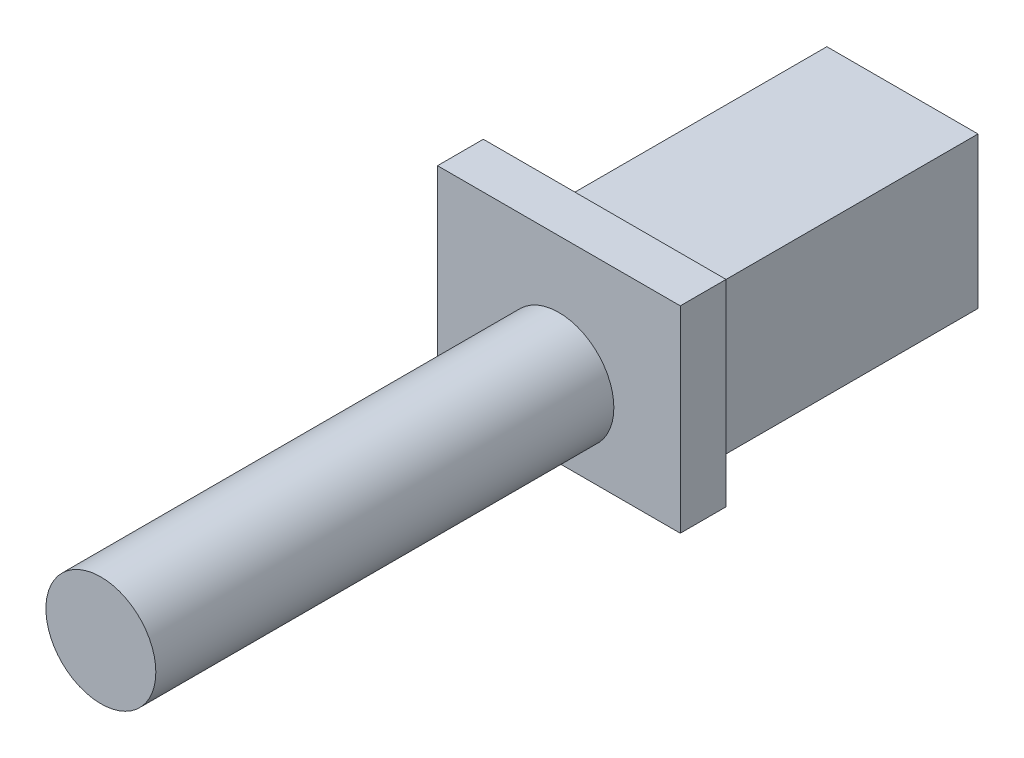
ISO-10303-21;
HEADER;
FILE_DESCRIPTION(('STEP AP214'),'2;1');
FILE_NAME('part.step','',(''),(''),'','','');
FILE_SCHEMA(('AUTOMOTIVE_DESIGN { 1 0 10303 214 1 1 1 1 }'));
ENDSEC;
DATA;
#1=APPLICATION_CONTEXT('core data for automotive mechanical design processes');
#2=APPLICATION_PROTOCOL_DEFINITION('international standard','automotive_design',2000,#1);
#3=PRODUCT_CONTEXT('',#1,'mechanical');
#4=PRODUCT('Part','Part','',(#3));
#5=PRODUCT_RELATED_PRODUCT_CATEGORY('part','',(#4));
#6=PRODUCT_DEFINITION_FORMATION('','',#4);
#7=PRODUCT_DEFINITION_CONTEXT('part definition',#1,'design');
#8=PRODUCT_DEFINITION('design','',#6,#7);
#9=PRODUCT_DEFINITION_SHAPE('','',#8);
#10=(LENGTH_UNIT() NAMED_UNIT(*) SI_UNIT(.MILLI.,.METRE.));
#11=(NAMED_UNIT(*) PLANE_ANGLE_UNIT() SI_UNIT($,.RADIAN.));
#12=(NAMED_UNIT(*) SI_UNIT($,.STERADIAN.) SOLID_ANGLE_UNIT());
#13=UNCERTAINTY_MEASURE_WITH_UNIT(LENGTH_MEASURE(1.E-05),#10,'distance_accuracy_value','');
#14=(GEOMETRIC_REPRESENTATION_CONTEXT(3) GLOBAL_UNCERTAINTY_ASSIGNED_CONTEXT((#13)) GLOBAL_UNIT_ASSIGNED_CONTEXT((#10,
#11,#12)) REPRESENTATION_CONTEXT('',''));
#15=CARTESIAN_POINT('',(0.,0.,0.));
#16=DIRECTION('',(0.,0.,1.));
#17=DIRECTION('',(1.,0.,0.));
#18=AXIS2_PLACEMENT_3D('',#15,#16,#17);
#19=CARTESIAN_POINT('',(3.3,0.,-15.));
#20=DIRECTION('',(-1.,0.,0.));
#21=DIRECTION('',(0.,-1.,0.));
#22=AXIS2_PLACEMENT_3D('',#19,#20,#21);
#23=PLANE('',#22);
#24=DIRECTION('',(0.,-1.,0.));
#25=VECTOR('',#24,1.);
#26=CARTESIAN_POINT('',(3.3,0.,-2.));
#27=LINE('',#26,#25);
#28=CARTESIAN_POINT('',(3.3,3.3,-2.));
#29=VERTEX_POINT('',#28);
#30=CARTESIAN_POINT('',(3.3,-3.3,-2.));
#31=VERTEX_POINT('',#30);
#32=EDGE_CURVE('E104',#29,#31,#27,.T.);
#33=ORIENTED_EDGE('',*,*,#32,.T.);
#34=DIRECTION('',(0.,0.,1.));
#35=VECTOR('',#34,1.);
#36=CARTESIAN_POINT('',(3.3,-3.3,-15.));
#37=LINE('',#36,#35);
#38=CARTESIAN_POINT('',(3.3,-3.3,-15.));
#39=VERTEX_POINT('',#38);
#40=EDGE_CURVE('E114',#39,#31,#37,.T.);
#41=ORIENTED_EDGE('',*,*,#40,.F.);
#42=DIRECTION('',(0.,-1.,0.));
#43=VECTOR('',#42,1.);
#44=CARTESIAN_POINT('',(3.3,0.,-15.));
#45=LINE('',#44,#43);
#46=CARTESIAN_POINT('',(3.3,3.3,-15.));
#47=VERTEX_POINT('',#46);
#48=EDGE_CURVE('E49',#47,#39,#45,.T.);
#49=ORIENTED_EDGE('',*,*,#48,.F.);
#50=DIRECTION('',(0.,0.,1.));
#51=VECTOR('',#50,1.);
#52=CARTESIAN_POINT('',(3.3,3.3,-15.));
#53=LINE('',#52,#51);
#54=EDGE_CURVE('E116',#47,#29,#53,.T.);
#55=ORIENTED_EDGE('',*,*,#54,.T.);
#56=EDGE_LOOP('',(#33,#41,#49,#55));
#57=FACE_BOUND('',#56,.T.);
#58=ADVANCED_FACE('F34',(#57),#23,.F.);
#59=CARTESIAN_POINT('',(-3.3,0.,-15.));
#60=DIRECTION('',(-1.,0.,0.));
#61=DIRECTION('',(0.,-1.,0.));
#62=AXIS2_PLACEMENT_3D('',#59,#60,#61);
#63=PLANE('',#62);
#64=DIRECTION('',(0.,0.,1.));
#65=VECTOR('',#64,1.);
#66=CARTESIAN_POINT('',(-3.3,-3.3,-15.));
#67=LINE('',#66,#65);
#68=CARTESIAN_POINT('',(-3.3,-3.3,-15.));
#69=VERTEX_POINT('',#68);
#70=CARTESIAN_POINT('',(-3.3,-3.3,-2.));
#71=VERTEX_POINT('',#70);
#72=EDGE_CURVE('E57',#69,#71,#67,.T.);
#73=ORIENTED_EDGE('',*,*,#72,.T.);
#74=DIRECTION('',(0.,-1.,0.));
#75=VECTOR('',#74,1.);
#76=CARTESIAN_POINT('',(-3.3,0.,-2.));
#77=LINE('',#76,#75);
#78=CARTESIAN_POINT('',(-3.3,3.3,-2.));
#79=VERTEX_POINT('',#78);
#80=EDGE_CURVE('E156',#79,#71,#77,.T.);
#81=ORIENTED_EDGE('',*,*,#80,.F.);
#82=DIRECTION('',(0.,0.,1.));
#83=VECTOR('',#82,1.);
#84=CARTESIAN_POINT('',(-3.3,3.3,-15.));
#85=LINE('',#84,#83);
#86=CARTESIAN_POINT('',(-3.3,3.3,-15.));
#87=VERTEX_POINT('',#86);
#88=EDGE_CURVE('E123',#87,#79,#85,.T.);
#89=ORIENTED_EDGE('',*,*,#88,.F.);
#90=DIRECTION('',(0.,-1.,0.));
#91=VECTOR('',#90,1.);
#92=CARTESIAN_POINT('',(-3.3,0.,-15.));
#93=LINE('',#92,#91);
#94=EDGE_CURVE('E131',#87,#69,#93,.T.);
#95=ORIENTED_EDGE('',*,*,#94,.T.);
#96=EDGE_LOOP('',(#73,#81,#89,#95));
#97=FACE_BOUND('',#96,.T.);
#98=ADVANCED_FACE('F195',(#97),#63,.T.);
#99=CARTESIAN_POINT('',(0.,3.3,-15.));
#100=DIRECTION('',(0.,-1.,0.));
#101=DIRECTION('',(0.,0.,-1.));
#102=AXIS2_PLACEMENT_3D('',#99,#100,#101);
#103=PLANE('',#102);
#104=DIRECTION('',(1.,0.,0.));
#105=VECTOR('',#104,1.);
#106=CARTESIAN_POINT('',(0.,3.3,-2.));
#107=LINE('',#106,#105);
#108=EDGE_CURVE('E140',#79,#29,#107,.T.);
#109=ORIENTED_EDGE('',*,*,#108,.T.);
#110=ORIENTED_EDGE('',*,*,#54,.F.);
#111=DIRECTION('',(1.,0.,0.));
#112=VECTOR('',#111,1.);
#113=CARTESIAN_POINT('',(0.,3.3,-15.));
#114=LINE('',#113,#112);
#115=EDGE_CURVE('E132',#87,#47,#114,.T.);
#116=ORIENTED_EDGE('',*,*,#115,.F.);
#117=ORIENTED_EDGE('',*,*,#88,.T.);
#118=EDGE_LOOP('',(#109,#110,#116,#117));
#119=FACE_BOUND('',#118,.T.);
#120=ADVANCED_FACE('F188',(#119),#103,.F.);
#121=CARTESIAN_POINT('',(0.,0.,20.));
#122=DIRECTION('',(0.,0.,-1.));
#123=DIRECTION('',(-1.,0.,0.));
#124=AXIS2_PLACEMENT_3D('',#121,#122,#123);
#125=CYLINDRICAL_SURFACE('',#124,2.4);
#126=CARTESIAN_POINT('',(0.,0.,20.));
#127=DIRECTION('',(0.,0.,1.));
#128=DIRECTION('',(1.,0.,0.));
#129=AXIS2_PLACEMENT_3D('',#126,#127,#128);
#130=CIRCLE('',#129,2.4);
#131=CARTESIAN_POINT('',(2.4,0.,20.));
#132=VERTEX_POINT('',#131);
#133=EDGE_CURVE('E11',#132,#132,#130,.T.);
#134=ORIENTED_EDGE('',*,*,#133,.F.);
#135=EDGE_LOOP('',(#134));
#136=FACE_BOUND('',#135,.T.);
#137=CARTESIAN_POINT('',(0.,0.,0.));
#138=DIRECTION('',(0.,0.,1.));
#139=DIRECTION('',(1.,0.,0.));
#140=AXIS2_PLACEMENT_3D('',#137,#138,#139);
#141=CIRCLE('',#140,2.4);
#142=CARTESIAN_POINT('',(2.4,0.,0.));
#143=VERTEX_POINT('',#142);
#144=EDGE_CURVE('E38',#143,#143,#141,.T.);
#145=ORIENTED_EDGE('',*,*,#144,.T.);
#146=EDGE_LOOP('',(#145));
#147=FACE_BOUND('',#146,.T.);
#148=ADVANCED_FACE('F36',(#136,#147),#125,.T.);
#149=CARTESIAN_POINT('',(0.,0.,20.));
#150=DIRECTION('',(0.,0.,1.));
#151=DIRECTION('',(1.,0.,0.));
#152=AXIS2_PLACEMENT_3D('',#149,#150,#151);
#153=PLANE('',#152);
#154=ORIENTED_EDGE('',*,*,#133,.T.);
#155=EDGE_LOOP('',(#154));
#156=FACE_BOUND('',#155,.T.);
#157=ADVANCED_FACE('F187',(#156),#153,.T.);
#158=CARTESIAN_POINT('',(0.,-3.3,-15.));
#159=DIRECTION('',(0.,-1.,0.));
#160=DIRECTION('',(0.,0.,-1.));
#161=AXIS2_PLACEMENT_3D('',#158,#159,#160);
#162=PLANE('',#161);
#163=DIRECTION('',(1.,0.,0.));
#164=VECTOR('',#163,1.);
#165=CARTESIAN_POINT('',(0.,-3.3,0.));
#166=LINE('',#165,#164);
#167=CARTESIAN_POINT('',(-5.3,-3.3,0.));
#168=VERTEX_POINT('',#167);
#169=CARTESIAN_POINT('',(5.3,-3.3,0.));
#170=VERTEX_POINT('',#169);
#171=EDGE_CURVE('E126',#168,#170,#166,.T.);
#172=ORIENTED_EDGE('',*,*,#171,.F.);
#173=DIRECTION('',(0.,0.,1.));
#174=VECTOR('',#173,1.);
#175=CARTESIAN_POINT('',(-5.3,-3.3,-2.));
#176=LINE('',#175,#174);
#177=CARTESIAN_POINT('',(-5.3,-3.3,-2.));
#178=VERTEX_POINT('',#177);
#179=EDGE_CURVE('E146',#178,#168,#176,.T.);
#180=ORIENTED_EDGE('',*,*,#179,.F.);
#181=DIRECTION('',(-1.,0.,0.));
#182=VECTOR('',#181,1.);
#183=CARTESIAN_POINT('',(0.,-3.3,-2.));
#184=LINE('',#183,#182);
#185=EDGE_CURVE('E158',#71,#178,#184,.T.);
#186=ORIENTED_EDGE('',*,*,#185,.F.);
#187=ORIENTED_EDGE('',*,*,#72,.F.);
#188=DIRECTION('',(1.,0.,0.));
#189=VECTOR('',#188,1.);
#190=CARTESIAN_POINT('',(0.,-3.3,-15.));
#191=LINE('',#190,#189);
#192=EDGE_CURVE('E120',#69,#39,#191,.T.);
#193=ORIENTED_EDGE('',*,*,#192,.T.);
#194=ORIENTED_EDGE('',*,*,#40,.T.);
#195=DIRECTION('',(1.,0.,0.));
#196=VECTOR('',#195,1.);
#197=CARTESIAN_POINT('',(0.,-3.3,-2.));
#198=LINE('',#197,#196);
#199=CARTESIAN_POINT('',(5.3,-3.3,-2.));
#200=VERTEX_POINT('',#199);
#201=EDGE_CURVE('E101',#31,#200,#198,.T.);
#202=ORIENTED_EDGE('',*,*,#201,.T.);
#203=DIRECTION('',(0.,0.,1.));
#204=VECTOR('',#203,1.);
#205=CARTESIAN_POINT('',(5.3,-3.3,-2.));
#206=LINE('',#205,#204);
#207=EDGE_CURVE('E137',#200,#170,#206,.T.);
#208=ORIENTED_EDGE('',*,*,#207,.T.);
#209=EDGE_LOOP('',(#172,#180,#186,#187,#193,#194,#202,#208));
#210=FACE_BOUND('',#209,.T.);
#211=ADVANCED_FACE('F119',(#210),#162,.T.);
#212=CARTESIAN_POINT('',(0.,0.,-15.));
#213=DIRECTION('',(0.,0.,1.));
#214=DIRECTION('',(1.,0.,0.));
#215=AXIS2_PLACEMENT_3D('',#212,#213,#214);
#216=PLANE('',#215);
#217=ORIENTED_EDGE('',*,*,#48,.T.);
#218=ORIENTED_EDGE('',*,*,#192,.F.);
#219=ORIENTED_EDGE('',*,*,#94,.F.);
#220=ORIENTED_EDGE('',*,*,#115,.T.);
#221=EDGE_LOOP('',(#217,#218,#219,#220));
#222=FACE_BOUND('',#221,.T.);
#223=ADVANCED_FACE('F182',(#222),#216,.F.);
#224=CARTESIAN_POINT('',(0.,0.,0.));
#225=DIRECTION('',(0.,0.,1.));
#226=DIRECTION('',(1.,0.,0.));
#227=AXIS2_PLACEMENT_3D('',#224,#225,#226);
#228=PLANE('',#227);
#229=ORIENTED_EDGE('',*,*,#171,.T.);
#230=DIRECTION('',(0.,-1.,0.));
#231=VECTOR('',#230,1.);
#232=CARTESIAN_POINT('',(5.3,0.,0.));
#233=LINE('',#232,#231);
#234=CARTESIAN_POINT('',(5.3,5.3,0.));
#235=VERTEX_POINT('',#234);
#236=EDGE_CURVE('E152',#235,#170,#233,.T.);
#237=ORIENTED_EDGE('',*,*,#236,.F.);
#238=DIRECTION('',(1.,0.,0.));
#239=VECTOR('',#238,1.);
#240=CARTESIAN_POINT('',(0.,5.3,0.));
#241=LINE('',#240,#239);
#242=CARTESIAN_POINT('',(-5.3,5.3,0.));
#243=VERTEX_POINT('',#242);
#244=EDGE_CURVE('E150',#243,#235,#241,.T.);
#245=ORIENTED_EDGE('',*,*,#244,.F.);
#246=DIRECTION('',(0.,1.,0.));
#247=VECTOR('',#246,1.);
#248=CARTESIAN_POINT('',(-5.3,0.,0.));
#249=LINE('',#248,#247);
#250=EDGE_CURVE('E117',#168,#243,#249,.T.);
#251=ORIENTED_EDGE('',*,*,#250,.F.);
#252=EDGE_LOOP('',(#229,#237,#245,#251));
#253=FACE_BOUND('',#252,.T.);
#254=ORIENTED_EDGE('',*,*,#144,.F.);
#255=EDGE_LOOP('',(#254));
#256=FACE_BOUND('',#255,.T.);
#257=ADVANCED_FACE('F179',(#253,#256),#228,.T.);
#258=CARTESIAN_POINT('',(-5.3,0.,-2.));
#259=DIRECTION('',(1.,0.,0.));
#260=DIRECTION('',(0.,0.,-1.));
#261=AXIS2_PLACEMENT_3D('',#258,#259,#260);
#262=PLANE('',#261);
#263=ORIENTED_EDGE('',*,*,#250,.T.);
#264=DIRECTION('',(0.,0.,1.));
#265=VECTOR('',#264,1.);
#266=CARTESIAN_POINT('',(-5.3,5.3,-2.));
#267=LINE('',#266,#265);
#268=CARTESIAN_POINT('',(-5.3,5.3,-2.));
#269=VERTEX_POINT('',#268);
#270=EDGE_CURVE('E143',#269,#243,#267,.T.);
#271=ORIENTED_EDGE('',*,*,#270,.F.);
#272=DIRECTION('',(0.,1.,0.));
#273=VECTOR('',#272,1.);
#274=CARTESIAN_POINT('',(-5.3,0.,-2.));
#275=LINE('',#274,#273);
#276=EDGE_CURVE('E160',#178,#269,#275,.T.);
#277=ORIENTED_EDGE('',*,*,#276,.F.);
#278=ORIENTED_EDGE('',*,*,#179,.T.);
#279=EDGE_LOOP('',(#263,#271,#277,#278));
#280=FACE_BOUND('',#279,.T.);
#281=ADVANCED_FACE('F178',(#280),#262,.F.);
#282=CARTESIAN_POINT('',(0.,5.3,-2.));
#283=DIRECTION('',(0.,-1.,0.));
#284=DIRECTION('',(0.,0.,-1.));
#285=AXIS2_PLACEMENT_3D('',#282,#283,#284);
#286=PLANE('',#285);
#287=ORIENTED_EDGE('',*,*,#244,.T.);
#288=DIRECTION('',(0.,0.,1.));
#289=VECTOR('',#288,1.);
#290=CARTESIAN_POINT('',(5.3,5.3,-2.));
#291=LINE('',#290,#289);
#292=CARTESIAN_POINT('',(5.3,5.3,-2.));
#293=VERTEX_POINT('',#292);
#294=EDGE_CURVE('E139',#293,#235,#291,.T.);
#295=ORIENTED_EDGE('',*,*,#294,.F.);
#296=DIRECTION('',(1.,0.,0.));
#297=VECTOR('',#296,1.);
#298=CARTESIAN_POINT('',(0.,5.3,-2.));
#299=LINE('',#298,#297);
#300=EDGE_CURVE('E162',#269,#293,#299,.T.);
#301=ORIENTED_EDGE('',*,*,#300,.F.);
#302=ORIENTED_EDGE('',*,*,#270,.T.);
#303=EDGE_LOOP('',(#287,#295,#301,#302));
#304=FACE_BOUND('',#303,.T.);
#305=ADVANCED_FACE('F169',(#304),#286,.F.);
#306=CARTESIAN_POINT('',(5.3,0.,-2.));
#307=DIRECTION('',(-1.,0.,0.));
#308=DIRECTION('',(0.,-1.,0.));
#309=AXIS2_PLACEMENT_3D('',#306,#307,#308);
#310=PLANE('',#309);
#311=ORIENTED_EDGE('',*,*,#236,.T.);
#312=ORIENTED_EDGE('',*,*,#207,.F.);
#313=DIRECTION('',(0.,-1.,0.));
#314=VECTOR('',#313,1.);
#315=CARTESIAN_POINT('',(5.3,0.,-2.));
#316=LINE('',#315,#314);
#317=EDGE_CURVE('E107',#293,#200,#316,.T.);
#318=ORIENTED_EDGE('',*,*,#317,.F.);
#319=ORIENTED_EDGE('',*,*,#294,.T.);
#320=EDGE_LOOP('',(#311,#312,#318,#319));
#321=FACE_BOUND('',#320,.T.);
#322=ADVANCED_FACE('F173',(#321),#310,.F.);
#323=CARTESIAN_POINT('',(0.,0.,-2.));
#324=DIRECTION('',(0.,0.,1.));
#325=DIRECTION('',(1.,0.,0.));
#326=AXIS2_PLACEMENT_3D('',#323,#324,#325);
#327=PLANE('',#326);
#328=ORIENTED_EDGE('',*,*,#32,.F.);
#329=ORIENTED_EDGE('',*,*,#108,.F.);
#330=ORIENTED_EDGE('',*,*,#80,.T.);
#331=ORIENTED_EDGE('',*,*,#185,.T.);
#332=ORIENTED_EDGE('',*,*,#276,.T.);
#333=ORIENTED_EDGE('',*,*,#300,.T.);
#334=ORIENTED_EDGE('',*,*,#317,.T.);
#335=ORIENTED_EDGE('',*,*,#201,.F.);
#336=EDGE_LOOP('',(#328,#329,#330,#331,#332,#333,#334,#335));
#337=FACE_BOUND('',#336,.T.);
#338=ADVANCED_FACE('F103',(#337),#327,.F.);
#339=CLOSED_SHELL('',(#58,#98,#120,#148,#157,#211,#223,#257,#281,#305,#322,#338));
#340=MANIFOLD_SOLID_BREP('B2',#339);
#341=ADVANCED_BREP_SHAPE_REPRESENTATION('',(#18,#340),#14);
#342=SHAPE_DEFINITION_REPRESENTATION(#9,#341);
ENDSEC;
END-ISO-10303-21;
